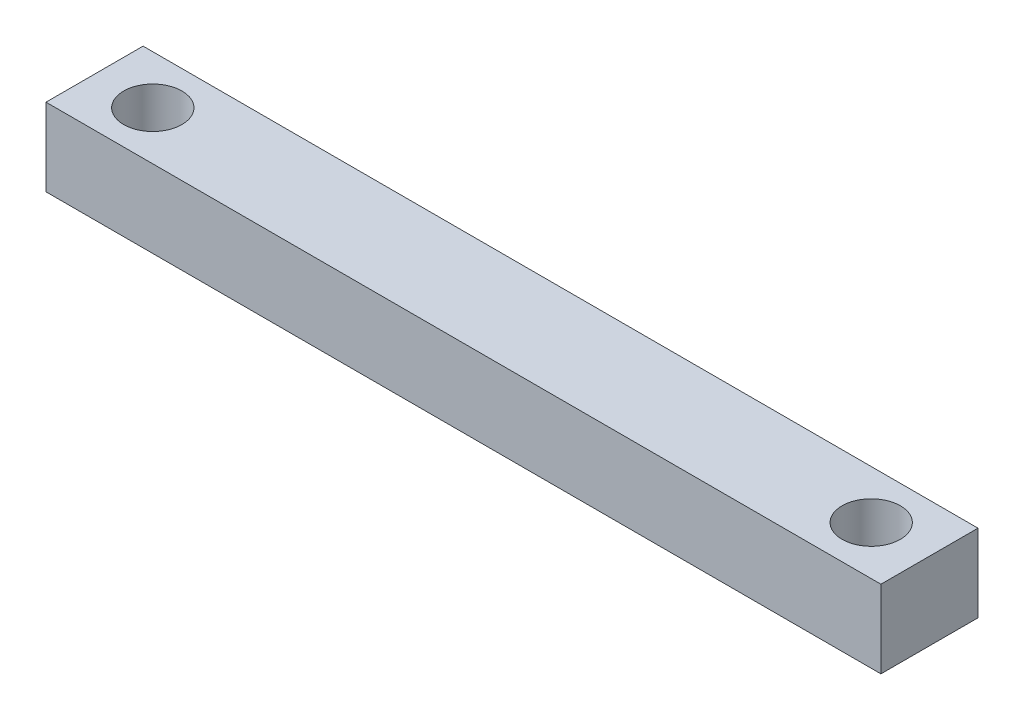
ISO-10303-21;
HEADER;
FILE_DESCRIPTION(('STEP AP214'),'2;1');
FILE_NAME('part.step','',(''),(''),'','','');
FILE_SCHEMA(('AUTOMOTIVE_DESIGN { 1 0 10303 214 1 1 1 1 }'));
ENDSEC;
DATA;
#1=APPLICATION_CONTEXT('core data for automotive mechanical design processes');
#2=APPLICATION_PROTOCOL_DEFINITION('international standard','automotive_design',2000,#1);
#3=PRODUCT_CONTEXT('',#1,'mechanical');
#4=PRODUCT('Part','Part','',(#3));
#5=PRODUCT_RELATED_PRODUCT_CATEGORY('part','',(#4));
#6=PRODUCT_DEFINITION_FORMATION('','',#4);
#7=PRODUCT_DEFINITION_CONTEXT('part definition',#1,'design');
#8=PRODUCT_DEFINITION('design','',#6,#7);
#9=PRODUCT_DEFINITION_SHAPE('','',#8);
#10=(LENGTH_UNIT() NAMED_UNIT(*) SI_UNIT(.MILLI.,.METRE.));
#11=(NAMED_UNIT(*) PLANE_ANGLE_UNIT() SI_UNIT($,.RADIAN.));
#12=(NAMED_UNIT(*) SI_UNIT($,.STERADIAN.) SOLID_ANGLE_UNIT());
#13=UNCERTAINTY_MEASURE_WITH_UNIT(LENGTH_MEASURE(1.E-05),#10,'distance_accuracy_value','');
#14=(GEOMETRIC_REPRESENTATION_CONTEXT(3) GLOBAL_UNCERTAINTY_ASSIGNED_CONTEXT((#13)) GLOBAL_UNIT_ASSIGNED_CONTEXT((#10,
#11,#12)) REPRESENTATION_CONTEXT('',''));
#15=CARTESIAN_POINT('',(0.,0.,0.));
#16=DIRECTION('',(0.,0.,1.));
#17=DIRECTION('',(1.,0.,0.));
#18=AXIS2_PLACEMENT_3D('',#15,#16,#17);
#19=CARTESIAN_POINT('',(-70.2190007586589,4.,-8.16301805219184));
#20=DIRECTION('',(1.,0.,0.));
#21=DIRECTION('',(0.,0.,-1.));
#22=AXIS2_PLACEMENT_3D('',#19,#20,#21);
#23=PLANE('',#22);
#24=DIRECTION('',(0.,0.,1.));
#25=VECTOR('',#24,1.);
#26=CARTESIAN_POINT('',(-70.2190007586589,0.,-8.16301805219184));
#27=LINE('',#26,#25);
#28=CARTESIAN_POINT('',(-70.2190007586589,0.,-8.16301805219184));
#29=VERTEX_POINT('',#28);
#30=CARTESIAN_POINT('',(-70.2190007586589,0.,-3.16301805219184));
#31=VERTEX_POINT('',#30);
#32=EDGE_CURVE('E95',#29,#31,#27,.T.);
#33=ORIENTED_EDGE('',*,*,#32,.T.);
#34=DIRECTION('',(0.,-1.,0.));
#35=VECTOR('',#34,1.);
#36=CARTESIAN_POINT('',(-70.2190007586589,4.,-3.16301805219184));
#37=LINE('',#36,#35);
#38=CARTESIAN_POINT('',(-70.2190007586589,4.,-3.16301805219184));
#39=VERTEX_POINT('',#38);
#40=EDGE_CURVE('E11',#39,#31,#37,.T.);
#41=ORIENTED_EDGE('',*,*,#40,.F.);
#42=DIRECTION('',(0.,0.,1.));
#43=VECTOR('',#42,1.);
#44=CARTESIAN_POINT('',(-70.2190007586589,4.,-8.16301805219184));
#45=LINE('',#44,#43);
#46=CARTESIAN_POINT('',(-70.2190007586589,4.,-8.16301805219184));
#47=VERTEX_POINT('',#46);
#48=EDGE_CURVE('E83',#47,#39,#45,.T.);
#49=ORIENTED_EDGE('',*,*,#48,.F.);
#50=DIRECTION('',(0.,-1.,0.));
#51=VECTOR('',#50,1.);
#52=CARTESIAN_POINT('',(-70.2190007586589,4.,-8.16301805219184));
#53=LINE('',#52,#51);
#54=EDGE_CURVE('E91',#47,#29,#53,.T.);
#55=ORIENTED_EDGE('',*,*,#54,.T.);
#56=EDGE_LOOP('',(#33,#41,#49,#55));
#57=FACE_BOUND('',#56,.T.);
#58=ADVANCED_FACE('F32',(#57),#23,.F.);
#59=CARTESIAN_POINT('',(-70.2190007586589,4.,-3.16301805219184));
#60=DIRECTION('',(0.,0.,-1.));
#61=DIRECTION('',(-1.,0.,0.));
#62=AXIS2_PLACEMENT_3D('',#59,#60,#61);
#63=PLANE('',#62);
#64=DIRECTION('',(1.,0.,0.));
#65=VECTOR('',#64,1.);
#66=CARTESIAN_POINT('',(-70.2190007586589,0.,-3.16301805219184));
#67=LINE('',#66,#65);
#68=CARTESIAN_POINT('',(-27.2190007586589,0.,-3.16301805219184));
#69=VERTEX_POINT('',#68);
#70=EDGE_CURVE('E87',#31,#69,#67,.T.);
#71=ORIENTED_EDGE('',*,*,#70,.T.);
#72=DIRECTION('',(0.,-1.,0.));
#73=VECTOR('',#72,1.);
#74=CARTESIAN_POINT('',(-27.2190007586589,4.,-3.16301805219184));
#75=LINE('',#74,#73);
#76=CARTESIAN_POINT('',(-27.2190007586589,4.,-3.16301805219184));
#77=VERTEX_POINT('',#76);
#78=EDGE_CURVE('E40',#77,#69,#75,.T.);
#79=ORIENTED_EDGE('',*,*,#78,.F.);
#80=DIRECTION('',(1.,0.,0.));
#81=VECTOR('',#80,1.);
#82=CARTESIAN_POINT('',(-70.2190007586589,4.,-3.16301805219184));
#83=LINE('',#82,#81);
#84=EDGE_CURVE('E78',#39,#77,#83,.T.);
#85=ORIENTED_EDGE('',*,*,#84,.F.);
#86=ORIENTED_EDGE('',*,*,#40,.T.);
#87=EDGE_LOOP('',(#71,#79,#85,#86));
#88=FACE_BOUND('',#87,.T.);
#89=ADVANCED_FACE('F86',(#88),#63,.F.);
#90=CARTESIAN_POINT('',(-27.2190007586589,4.,-8.16301805219184));
#91=DIRECTION('',(-1.,0.,0.));
#92=DIRECTION('',(0.,0.,1.));
#93=AXIS2_PLACEMENT_3D('',#90,#91,#92);
#94=PLANE('',#93);
#95=DIRECTION('',(0.,0.,-1.));
#96=VECTOR('',#95,1.);
#97=CARTESIAN_POINT('',(-27.2190007586589,0.,-8.16301805219184));
#98=LINE('',#97,#96);
#99=CARTESIAN_POINT('',(-27.2190007586589,0.,-8.16301805219184));
#100=VERTEX_POINT('',#99);
#101=EDGE_CURVE('E65',#69,#100,#98,.T.);
#102=ORIENTED_EDGE('',*,*,#101,.T.);
#103=DIRECTION('',(0.,-1.,0.));
#104=VECTOR('',#103,1.);
#105=CARTESIAN_POINT('',(-27.2190007586589,4.,-8.16301805219184));
#106=LINE('',#105,#104);
#107=CARTESIAN_POINT('',(-27.2190007586589,4.,-8.16301805219184));
#108=VERTEX_POINT('',#107);
#109=EDGE_CURVE('E88',#108,#100,#106,.T.);
#110=ORIENTED_EDGE('',*,*,#109,.F.);
#111=DIRECTION('',(0.,0.,-1.));
#112=VECTOR('',#111,1.);
#113=CARTESIAN_POINT('',(-27.2190007586589,4.,-8.16301805219184));
#114=LINE('',#113,#112);
#115=EDGE_CURVE('E81',#77,#108,#114,.T.);
#116=ORIENTED_EDGE('',*,*,#115,.F.);
#117=ORIENTED_EDGE('',*,*,#78,.T.);
#118=EDGE_LOOP('',(#102,#110,#116,#117));
#119=FACE_BOUND('',#118,.T.);
#120=ADVANCED_FACE('F89',(#119),#94,.F.);
#121=CARTESIAN_POINT('',(-70.2190007586589,4.,-8.16301805219184));
#122=DIRECTION('',(0.,0.,1.));
#123=DIRECTION('',(1.,0.,0.));
#124=AXIS2_PLACEMENT_3D('',#121,#122,#123);
#125=PLANE('',#124);
#126=DIRECTION('',(-1.,0.,0.));
#127=VECTOR('',#126,1.);
#128=CARTESIAN_POINT('',(-70.2190007586589,0.,-8.16301805219184));
#129=LINE('',#128,#127);
#130=EDGE_CURVE('E71',#100,#29,#129,.T.);
#131=ORIENTED_EDGE('',*,*,#130,.T.);
#132=ORIENTED_EDGE('',*,*,#54,.F.);
#133=DIRECTION('',(-1.,0.,0.));
#134=VECTOR('',#133,1.);
#135=CARTESIAN_POINT('',(-70.2190007586589,4.,-8.16301805219184));
#136=LINE('',#135,#134);
#137=EDGE_CURVE('E48',#108,#47,#136,.T.);
#138=ORIENTED_EDGE('',*,*,#137,.F.);
#139=ORIENTED_EDGE('',*,*,#109,.T.);
#140=EDGE_LOOP('',(#131,#132,#138,#139));
#141=FACE_BOUND('',#140,.T.);
#142=ADVANCED_FACE('F103',(#141),#125,.F.);
#143=CARTESIAN_POINT('',(-70.2190007586589,4.,-3.16301805219184));
#144=DIRECTION('',(0.,1.,0.));
#145=DIRECTION('',(0.,0.,1.));
#146=AXIS2_PLACEMENT_3D('',#143,#144,#145);
#147=PLANE('',#146);
#148=CARTESIAN_POINT('',(-30.2190007586589,4.,-5.66301805219184));
#149=DIRECTION('',(0.,1.,0.));
#150=DIRECTION('',(0.,0.,1.));
#151=AXIS2_PLACEMENT_3D('',#148,#149,#150);
#152=CIRCLE('',#151,1.5);
#153=CARTESIAN_POINT('',(-30.2190007586589,4.,-4.16301805219184));
#154=VERTEX_POINT('',#153);
#155=EDGE_CURVE('E115',#154,#154,#152,.T.);
#156=ORIENTED_EDGE('',*,*,#155,.F.);
#157=EDGE_LOOP('',(#156));
#158=FACE_BOUND('',#157,.T.);
#159=CARTESIAN_POINT('',(-67.2190007586589,4.,-5.66301805219184));
#160=DIRECTION('',(0.,1.,0.));
#161=DIRECTION('',(0.,0.,1.));
#162=AXIS2_PLACEMENT_3D('',#159,#160,#161);
#163=CIRCLE('',#162,1.5);
#164=CARTESIAN_POINT('',(-67.2190007586589,4.,-4.16301805219184));
#165=VERTEX_POINT('',#164);
#166=EDGE_CURVE('E109',#165,#165,#163,.T.);
#167=ORIENTED_EDGE('',*,*,#166,.F.);
#168=EDGE_LOOP('',(#167));
#169=FACE_BOUND('',#168,.T.);
#170=ORIENTED_EDGE('',*,*,#48,.T.);
#171=ORIENTED_EDGE('',*,*,#84,.T.);
#172=ORIENTED_EDGE('',*,*,#115,.T.);
#173=ORIENTED_EDGE('',*,*,#137,.T.);
#174=EDGE_LOOP('',(#170,#171,#172,#173));
#175=FACE_BOUND('',#174,.T.);
#176=ADVANCED_FACE('F79',(#158,#169,#175),#147,.T.);
#177=CARTESIAN_POINT('',(-70.2190007586589,0.,-3.16301805219184));
#178=DIRECTION('',(0.,1.,0.));
#179=DIRECTION('',(0.,0.,1.));
#180=AXIS2_PLACEMENT_3D('',#177,#178,#179);
#181=PLANE('',#180);
#182=CARTESIAN_POINT('',(-30.2190007586589,0.,-5.66301805219184));
#183=DIRECTION('',(0.,1.,0.));
#184=DIRECTION('',(0.,0.,1.));
#185=AXIS2_PLACEMENT_3D('',#182,#183,#184);
#186=CIRCLE('',#185,1.5);
#187=CARTESIAN_POINT('',(-30.2190007586589,0.,-4.16301805219184));
#188=VERTEX_POINT('',#187);
#189=EDGE_CURVE('E112',#188,#188,#186,.T.);
#190=ORIENTED_EDGE('',*,*,#189,.T.);
#191=EDGE_LOOP('',(#190));
#192=FACE_BOUND('',#191,.T.);
#193=CARTESIAN_POINT('',(-67.2190007586589,0.,-5.66301805219184));
#194=DIRECTION('',(0.,1.,0.));
#195=DIRECTION('',(0.,0.,1.));
#196=AXIS2_PLACEMENT_3D('',#193,#194,#195);
#197=CIRCLE('',#196,1.5);
#198=CARTESIAN_POINT('',(-67.2190007586589,0.,-4.16301805219184));
#199=VERTEX_POINT('',#198);
#200=EDGE_CURVE('E98',#199,#199,#197,.T.);
#201=ORIENTED_EDGE('',*,*,#200,.T.);
#202=EDGE_LOOP('',(#201));
#203=FACE_BOUND('',#202,.T.);
#204=ORIENTED_EDGE('',*,*,#32,.F.);
#205=ORIENTED_EDGE('',*,*,#130,.F.);
#206=ORIENTED_EDGE('',*,*,#101,.F.);
#207=ORIENTED_EDGE('',*,*,#70,.F.);
#208=EDGE_LOOP('',(#204,#205,#206,#207));
#209=FACE_BOUND('',#208,.T.);
#210=ADVANCED_FACE('F106',(#192,#203,#209),#181,.F.);
#211=CARTESIAN_POINT('',(-67.2190007586589,0.,-5.66301805219184));
#212=DIRECTION('',(0.,1.,0.));
#213=DIRECTION('',(0.,0.,1.));
#214=AXIS2_PLACEMENT_3D('',#211,#212,#213);
#215=CYLINDRICAL_SURFACE('',#214,1.5);
#216=ORIENTED_EDGE('',*,*,#200,.F.);
#217=EDGE_LOOP('',(#216));
#218=FACE_BOUND('',#217,.T.);
#219=ORIENTED_EDGE('',*,*,#166,.T.);
#220=EDGE_LOOP('',(#219));
#221=FACE_BOUND('',#220,.T.);
#222=ADVANCED_FACE('F126',(#218,#221),#215,.F.);
#223=CARTESIAN_POINT('',(-30.2190007586589,0.,-5.66301805219184));
#224=DIRECTION('',(0.,1.,0.));
#225=DIRECTION('',(0.,0.,1.));
#226=AXIS2_PLACEMENT_3D('',#223,#224,#225);
#227=CYLINDRICAL_SURFACE('',#226,1.5);
#228=ORIENTED_EDGE('',*,*,#189,.F.);
#229=EDGE_LOOP('',(#228));
#230=FACE_BOUND('',#229,.T.);
#231=ORIENTED_EDGE('',*,*,#155,.T.);
#232=EDGE_LOOP('',(#231));
#233=FACE_BOUND('',#232,.T.);
#234=ADVANCED_FACE('F123',(#230,#233),#227,.F.);
#235=CLOSED_SHELL('',(#58,#89,#120,#142,#176,#210,#222,#234));
#236=MANIFOLD_SOLID_BREP('B2',#235);
#237=ADVANCED_BREP_SHAPE_REPRESENTATION('',(#18,#236),#14);
#238=SHAPE_DEFINITION_REPRESENTATION(#9,#237);
ENDSEC;
END-ISO-10303-21;
